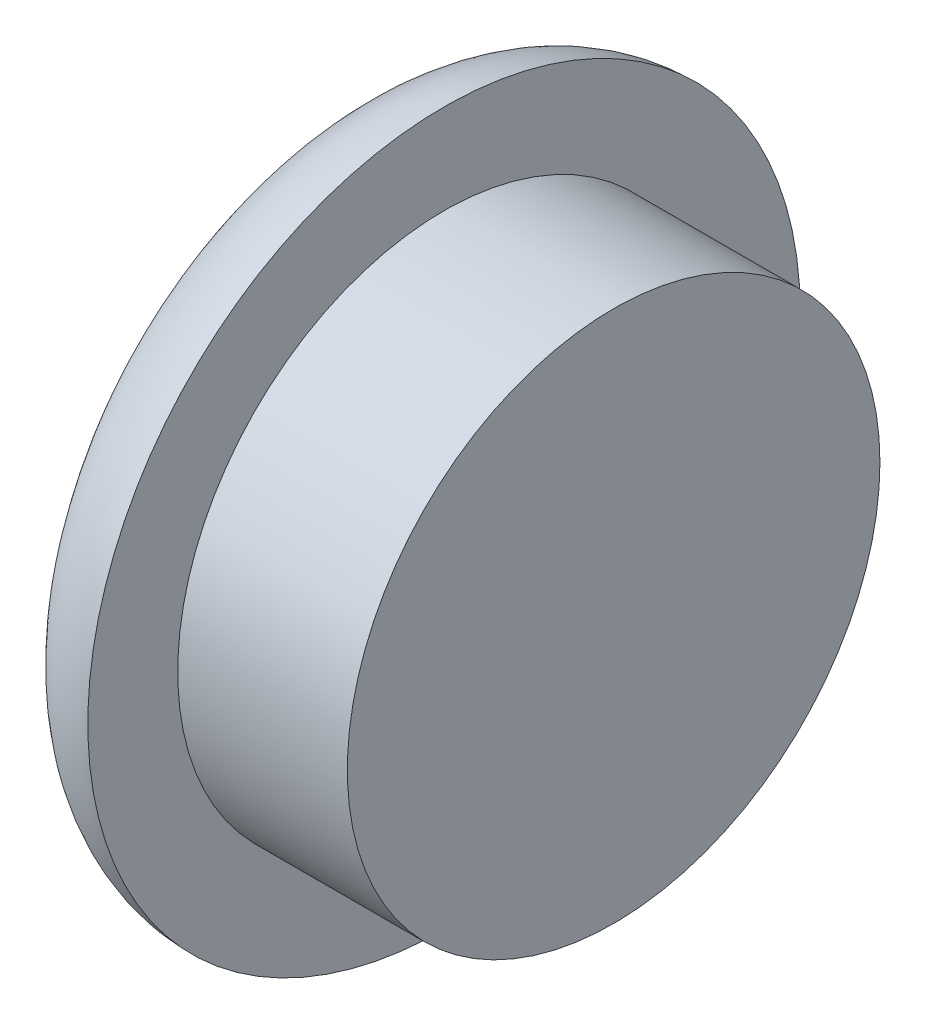
ISO-10303-21;
HEADER;
FILE_DESCRIPTION(('STEP AP214'),'2;1');
FILE_NAME('part.step','',(''),(''),'','','');
FILE_SCHEMA(('AUTOMOTIVE_DESIGN { 1 0 10303 214 1 1 1 1 }'));
ENDSEC;
DATA;
#1=APPLICATION_CONTEXT('core data for automotive mechanical design processes');
#2=APPLICATION_PROTOCOL_DEFINITION('international standard','automotive_design',2000,#1);
#3=PRODUCT_CONTEXT('',#1,'mechanical');
#4=PRODUCT('Part','Part','',(#3));
#5=PRODUCT_RELATED_PRODUCT_CATEGORY('part','',(#4));
#6=PRODUCT_DEFINITION_FORMATION('','',#4);
#7=PRODUCT_DEFINITION_CONTEXT('part definition',#1,'design');
#8=PRODUCT_DEFINITION('design','',#6,#7);
#9=PRODUCT_DEFINITION_SHAPE('','',#8);
#10=(LENGTH_UNIT() NAMED_UNIT(*) SI_UNIT(.MILLI.,.METRE.));
#11=(NAMED_UNIT(*) PLANE_ANGLE_UNIT() SI_UNIT($,.RADIAN.));
#12=(NAMED_UNIT(*) SI_UNIT($,.STERADIAN.) SOLID_ANGLE_UNIT());
#13=UNCERTAINTY_MEASURE_WITH_UNIT(LENGTH_MEASURE(1.E-05),#10,'distance_accuracy_value','');
#14=(GEOMETRIC_REPRESENTATION_CONTEXT(3) GLOBAL_UNCERTAINTY_ASSIGNED_CONTEXT((#13)) GLOBAL_UNIT_ASSIGNED_CONTEXT((#10,
#11,#12)) REPRESENTATION_CONTEXT('',''));
#15=CARTESIAN_POINT('',(0.,0.,0.));
#16=DIRECTION('',(0.,0.,1.));
#17=DIRECTION('',(1.,0.,0.));
#18=AXIS2_PLACEMENT_3D('',#15,#16,#17);
#19=CARTESIAN_POINT('',(5.,0.,0.));
#20=DIRECTION('',(-1.,0.,0.));
#21=DIRECTION('',(0.,0.,1.));
#22=AXIS2_PLACEMENT_3D('',#19,#20,#21);
#23=CYLINDRICAL_SURFACE('',#22,7.85);
#24=CARTESIAN_POINT('',(5.,0.,0.));
#25=DIRECTION('',(1.,0.,0.));
#26=DIRECTION('',(0.,0.,-1.));
#27=AXIS2_PLACEMENT_3D('',#24,#25,#26);
#28=CIRCLE('',#27,7.85);
#29=CARTESIAN_POINT('',(5.,0.,-7.85));
#30=VERTEX_POINT('',#29);
#31=EDGE_CURVE('E43',#30,#30,#28,.T.);
#32=ORIENTED_EDGE('',*,*,#31,.F.);
#33=EDGE_LOOP('',(#32));
#34=FACE_BOUND('',#33,.T.);
#35=CARTESIAN_POINT('',(0.,0.,0.));
#36=DIRECTION('',(1.,0.,0.));
#37=DIRECTION('',(0.,0.,-1.));
#38=AXIS2_PLACEMENT_3D('',#35,#36,#37);
#39=CIRCLE('',#38,7.85);
#40=CARTESIAN_POINT('',(0.,0.,-7.85));
#41=VERTEX_POINT('',#40);
#42=EDGE_CURVE('E49',#41,#41,#39,.T.);
#43=ORIENTED_EDGE('',*,*,#42,.T.);
#44=EDGE_LOOP('',(#43));
#45=FACE_BOUND('',#44,.T.);
#46=ADVANCED_FACE('F35',(#34,#45),#23,.T.);
#47=CARTESIAN_POINT('',(5.,0.,0.));
#48=DIRECTION('',(1.,0.,0.));
#49=DIRECTION('',(0.,0.,-1.));
#50=AXIS2_PLACEMENT_3D('',#47,#48,#49);
#51=PLANE('',#50);
#52=ORIENTED_EDGE('',*,*,#31,.T.);
#53=EDGE_LOOP('',(#52));
#54=FACE_BOUND('',#53,.T.);
#55=ADVANCED_FACE('F71',(#54),#51,.T.);
#56=CARTESIAN_POINT('',(0.,0.,0.));
#57=DIRECTION('',(1.,0.,0.));
#58=DIRECTION('',(0.,0.,-1.));
#59=AXIS2_PLACEMENT_3D('',#56,#57,#58);
#60=PLANE('',#59);
#61=CARTESIAN_POINT('',(0.,0.,0.));
#62=DIRECTION('',(1.,0.,0.));
#63=DIRECTION('',(0.,0.,-1.));
#64=AXIS2_PLACEMENT_3D('',#61,#62,#63);
#65=CIRCLE('',#64,10.5);
#66=CARTESIAN_POINT('',(0.,0.,-10.5));
#67=VERTEX_POINT('',#66);
#68=EDGE_CURVE('E54',#67,#67,#65,.T.);
#69=ORIENTED_EDGE('',*,*,#68,.T.);
#70=EDGE_LOOP('',(#69));
#71=FACE_BOUND('',#70,.T.);
#72=ORIENTED_EDGE('',*,*,#42,.F.);
#73=EDGE_LOOP('',(#72));
#74=FACE_BOUND('',#73,.T.);
#75=ADVANCED_FACE('F60',(#71,#74),#60,.T.);
#76=CARTESIAN_POINT('',(-3.,0.,0.));
#77=DIRECTION('',(1.,0.,0.));
#78=DIRECTION('',(0.,0.,-1.));
#79=AXIS2_PLACEMENT_3D('',#76,#77,#78);
#80=PLANE('',#79);
#81=CARTESIAN_POINT('',(-3.,0.,0.));
#82=DIRECTION('',(1.,0.,0.));
#83=DIRECTION('',(0.,0.,-1.));
#84=AXIS2_PLACEMENT_3D('',#81,#82,#83);
#85=CIRCLE('',#84,7.5);
#86=CARTESIAN_POINT('',(-3.,0.,-7.5));
#87=VERTEX_POINT('',#86);
#88=EDGE_CURVE('E10',#87,#87,#85,.F.);
#89=ORIENTED_EDGE('',*,*,#88,.T.);
#90=EDGE_LOOP('',(#89));
#91=FACE_BOUND('',#90,.T.);
#92=ADVANCED_FACE('F64',(#91),#80,.F.);
#93=CARTESIAN_POINT('',(0.,0.,0.));
#94=DIRECTION('',(1.,0.,0.));
#95=DIRECTION('',(0.,0.,-1.));
#96=AXIS2_PLACEMENT_3D('',#93,#94,#95);
#97=TOROIDAL_SURFACE('',#96,7.5,3.);
#98=ORIENTED_EDGE('',*,*,#88,.F.);
#99=EDGE_LOOP('',(#98));
#100=FACE_BOUND('',#99,.T.);
#101=ORIENTED_EDGE('',*,*,#68,.F.);
#102=EDGE_LOOP('',(#101));
#103=FACE_BOUND('',#102,.T.);
#104=ADVANCED_FACE('F37',(#100,#103),#97,.T.);
#105=CLOSED_SHELL('',(#46,#55,#75,#92,#104));
#106=MANIFOLD_SOLID_BREP('B2',#105);
#107=ADVANCED_BREP_SHAPE_REPRESENTATION('',(#18,#106),#14);
#108=SHAPE_DEFINITION_REPRESENTATION(#9,#107);
ENDSEC;
END-ISO-10303-21;
